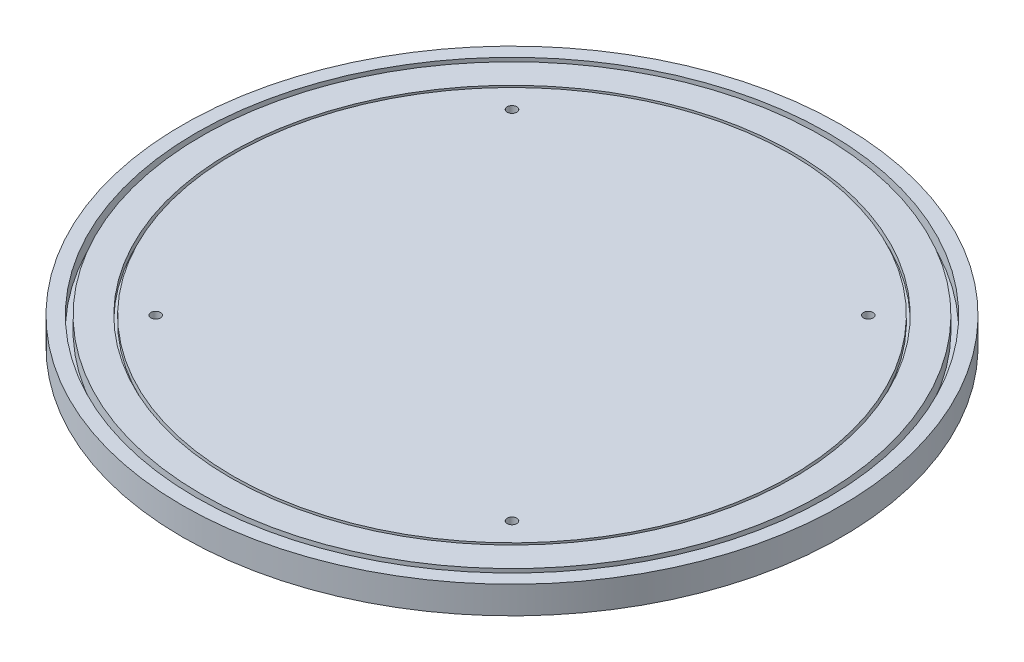
ISO-10303-21;
HEADER;
FILE_DESCRIPTION(('STEP AP214'),'2;1');
FILE_NAME('part.step','',(''),(''),'','','');
FILE_SCHEMA(('AUTOMOTIVE_DESIGN { 1 0 10303 214 1 1 1 1 }'));
ENDSEC;
DATA;
#1=APPLICATION_CONTEXT('core data for automotive mechanical design processes');
#2=APPLICATION_PROTOCOL_DEFINITION('international standard','automotive_design',2000,#1);
#3=PRODUCT_CONTEXT('',#1,'mechanical');
#4=PRODUCT('Part','Part','',(#3));
#5=PRODUCT_RELATED_PRODUCT_CATEGORY('part','',(#4));
#6=PRODUCT_DEFINITION_FORMATION('','',#4);
#7=PRODUCT_DEFINITION_CONTEXT('part definition',#1,'design');
#8=PRODUCT_DEFINITION('design','',#6,#7);
#9=PRODUCT_DEFINITION_SHAPE('','',#8);
#10=(LENGTH_UNIT() NAMED_UNIT(*) SI_UNIT(.MILLI.,.METRE.));
#11=(NAMED_UNIT(*) PLANE_ANGLE_UNIT() SI_UNIT($,.RADIAN.));
#12=(NAMED_UNIT(*) SI_UNIT($,.STERADIAN.) SOLID_ANGLE_UNIT());
#13=UNCERTAINTY_MEASURE_WITH_UNIT(LENGTH_MEASURE(1.E-05),#10,'distance_accuracy_value','');
#14=(GEOMETRIC_REPRESENTATION_CONTEXT(3) GLOBAL_UNCERTAINTY_ASSIGNED_CONTEXT((#13)) GLOBAL_UNIT_ASSIGNED_CONTEXT((#10,
#11,#12)) REPRESENTATION_CONTEXT('',''));
#15=CARTESIAN_POINT('',(0.,0.,0.));
#16=DIRECTION('',(0.,0.,1.));
#17=DIRECTION('',(1.,0.,0.));
#18=AXIS2_PLACEMENT_3D('',#15,#16,#17);
#19=CARTESIAN_POINT('',(0.,10.,-115.250303869911));
#20=DIRECTION('',(0.,-1.,0.));
#21=DIRECTION('',(0.,0.,-1.));
#22=AXIS2_PLACEMENT_3D('',#19,#20,#21);
#23=PLANE('',#22);
#24=CARTESIAN_POINT('',(0.,10.,-0.00437551765879174));
#25=DIRECTION('',(0.,1.,0.));
#26=DIRECTION('',(0.,0.,1.));
#27=AXIS2_PLACEMENT_3D('',#24,#25,#26);
#28=CIRCLE('',#27,115.245928352253);
#29=CARTESIAN_POINT('',(0.,10.,115.241552834594));
#30=VERTEX_POINT('',#29);
#31=EDGE_CURVE('E69',#30,#30,#28,.T.);
#32=ORIENTED_EDGE('',*,*,#31,.F.);
#33=EDGE_LOOP('',(#32));
#34=FACE_BOUND('',#33,.T.);
#35=CARTESIAN_POINT('',(0.,10.,-0.00437551765879174));
#36=DIRECTION('',(0.,1.,0.));
#37=DIRECTION('',(0.,0.,1.));
#38=AXIS2_PLACEMENT_3D('',#35,#36,#37);
#39=CIRCLE('',#38,120.249921644883);
#40=CARTESIAN_POINT('',(0.,10.,120.245546127224));
#41=VERTEX_POINT('',#40);
#42=EDGE_CURVE('E10',#41,#41,#39,.T.);
#43=ORIENTED_EDGE('',*,*,#42,.T.);
#44=EDGE_LOOP('',(#43));
#45=FACE_BOUND('',#44,.T.);
#46=ADVANCED_FACE('F35',(#34,#45),#23,.F.);
#47=CARTESIAN_POINT('',(0.,9.99999999999999,-0.00437551765879174));
#48=DIRECTION('',(0.,1.,0.));
#49=DIRECTION('',(0.,0.,1.));
#50=AXIS2_PLACEMENT_3D('',#47,#48,#49);
#51=CYLINDRICAL_SURFACE('',#50,120.249921644883);
#52=ORIENTED_EDGE('',*,*,#42,.F.);
#53=EDGE_LOOP('',(#52));
#54=FACE_BOUND('',#53,.T.);
#55=CARTESIAN_POINT('',(0.,0.,-0.00437551765879174));
#56=DIRECTION('',(0.,1.,0.));
#57=DIRECTION('',(0.,0.,1.));
#58=AXIS2_PLACEMENT_3D('',#55,#56,#57);
#59=CIRCLE('',#58,120.249921644883);
#60=CARTESIAN_POINT('',(0.,0.,120.245546127224));
#61=VERTEX_POINT('',#60);
#62=EDGE_CURVE('E41',#61,#61,#59,.T.);
#63=ORIENTED_EDGE('',*,*,#62,.T.);
#64=EDGE_LOOP('',(#63));
#65=FACE_BOUND('',#64,.T.);
#66=ADVANCED_FACE('F111',(#54,#65),#51,.T.);
#67=CARTESIAN_POINT('',(0.,0.,-120.254297162542));
#68=DIRECTION('',(0.,1.,0.));
#69=DIRECTION('',(0.,0.,1.));
#70=AXIS2_PLACEMENT_3D('',#67,#68,#69);
#71=PLANE('',#70);
#72=CARTESIAN_POINT('',(-65.,0.,-65.));
#73=DIRECTION('',(0.,-1.,0.));
#74=DIRECTION('',(0.,0.,-1.));
#75=AXIS2_PLACEMENT_3D('',#72,#73,#74);
#76=CIRCLE('',#75,1.75);
#77=CARTESIAN_POINT('',(-65.,0.,-66.75));
#78=VERTEX_POINT('',#77);
#79=EDGE_CURVE('E86',#78,#78,#76,.T.);
#80=ORIENTED_EDGE('',*,*,#79,.F.);
#81=EDGE_LOOP('',(#80));
#82=FACE_BOUND('',#81,.T.);
#83=CARTESIAN_POINT('',(65.,0.,65.));
#84=DIRECTION('',(0.,-1.,0.));
#85=DIRECTION('',(0.,0.,-1.));
#86=AXIS2_PLACEMENT_3D('',#83,#84,#85);
#87=CIRCLE('',#86,1.75);
#88=CARTESIAN_POINT('',(65.,0.,63.25));
#89=VERTEX_POINT('',#88);
#90=EDGE_CURVE('E79',#89,#89,#87,.T.);
#91=ORIENTED_EDGE('',*,*,#90,.F.);
#92=EDGE_LOOP('',(#91));
#93=FACE_BOUND('',#92,.T.);
#94=CARTESIAN_POINT('',(65.,0.,-65.));
#95=DIRECTION('',(0.,-1.,0.));
#96=DIRECTION('',(0.,0.,-1.));
#97=AXIS2_PLACEMENT_3D('',#94,#95,#96);
#98=CIRCLE('',#97,1.75);
#99=CARTESIAN_POINT('',(65.,0.,-66.75));
#100=VERTEX_POINT('',#99);
#101=EDGE_CURVE('E91',#100,#100,#98,.T.);
#102=ORIENTED_EDGE('',*,*,#101,.F.);
#103=EDGE_LOOP('',(#102));
#104=FACE_BOUND('',#103,.T.);
#105=CARTESIAN_POINT('',(-65.,0.,65.));
#106=DIRECTION('',(0.,-1.,0.));
#107=DIRECTION('',(0.,0.,-1.));
#108=AXIS2_PLACEMENT_3D('',#105,#106,#107);
#109=CIRCLE('',#108,1.75);
#110=CARTESIAN_POINT('',(-65.,0.,63.25));
#111=VERTEX_POINT('',#110);
#112=EDGE_CURVE('E73',#111,#111,#109,.T.);
#113=ORIENTED_EDGE('',*,*,#112,.F.);
#114=EDGE_LOOP('',(#113));
#115=FACE_BOUND('',#114,.T.);
#116=ORIENTED_EDGE('',*,*,#62,.F.);
#117=EDGE_LOOP('',(#116));
#118=FACE_BOUND('',#117,.T.);
#119=ADVANCED_FACE('F108',(#82,#93,#104,#115,#118),#71,.F.);
#120=CARTESIAN_POINT('',(0.,9.99999999999999,-101.754375517659));
#121=DIRECTION('',(0.,-1.,0.));
#122=DIRECTION('',(0.,0.,-1.));
#123=AXIS2_PLACEMENT_3D('',#120,#121,#122);
#124=PLANE('',#123);
#125=CARTESIAN_POINT('',(-65.,10.,-65.));
#126=DIRECTION('',(0.,-1.,0.));
#127=DIRECTION('',(0.,0.,-1.));
#128=AXIS2_PLACEMENT_3D('',#125,#126,#127);
#129=CIRCLE('',#128,1.75);
#130=CARTESIAN_POINT('',(-65.,10.,-66.75));
#131=VERTEX_POINT('',#130);
#132=EDGE_CURVE('E76',#131,#131,#129,.T.);
#133=ORIENTED_EDGE('',*,*,#132,.T.);
#134=EDGE_LOOP('',(#133));
#135=FACE_BOUND('',#134,.T.);
#136=CARTESIAN_POINT('',(65.,10.,65.));
#137=DIRECTION('',(0.,-1.,0.));
#138=DIRECTION('',(0.,0.,-1.));
#139=AXIS2_PLACEMENT_3D('',#136,#137,#138);
#140=CIRCLE('',#139,1.75);
#141=CARTESIAN_POINT('',(65.,10.,63.25));
#142=VERTEX_POINT('',#141);
#143=EDGE_CURVE('E82',#142,#142,#140,.T.);
#144=ORIENTED_EDGE('',*,*,#143,.T.);
#145=EDGE_LOOP('',(#144));
#146=FACE_BOUND('',#145,.T.);
#147=CARTESIAN_POINT('',(65.,10.,-65.));
#148=DIRECTION('',(0.,-1.,0.));
#149=DIRECTION('',(0.,0.,-1.));
#150=AXIS2_PLACEMENT_3D('',#147,#148,#149);
#151=CIRCLE('',#150,1.75);
#152=CARTESIAN_POINT('',(65.,10.,-66.75));
#153=VERTEX_POINT('',#152);
#154=EDGE_CURVE('E83',#153,#153,#151,.T.);
#155=ORIENTED_EDGE('',*,*,#154,.T.);
#156=EDGE_LOOP('',(#155));
#157=FACE_BOUND('',#156,.T.);
#158=CARTESIAN_POINT('',(-65.,10.,65.));
#159=DIRECTION('',(0.,-1.,0.));
#160=DIRECTION('',(0.,0.,-1.));
#161=AXIS2_PLACEMENT_3D('',#158,#159,#160);
#162=CIRCLE('',#161,1.75);
#163=CARTESIAN_POINT('',(-65.,10.,63.25));
#164=VERTEX_POINT('',#163);
#165=EDGE_CURVE('E72',#164,#164,#162,.T.);
#166=ORIENTED_EDGE('',*,*,#165,.T.);
#167=EDGE_LOOP('',(#166));
#168=FACE_BOUND('',#167,.T.);
#169=CARTESIAN_POINT('',(0.,10.,-0.00437551765879174));
#170=DIRECTION('',(0.,1.,0.));
#171=DIRECTION('',(0.,0.,1.));
#172=AXIS2_PLACEMENT_3D('',#169,#170,#171);
#173=CIRCLE('',#172,101.75);
#174=CARTESIAN_POINT('',(0.,10.,101.745624482341));
#175=VERTEX_POINT('',#174);
#176=EDGE_CURVE('E45',#175,#175,#173,.T.);
#177=ORIENTED_EDGE('',*,*,#176,.T.);
#178=EDGE_LOOP('',(#177));
#179=FACE_BOUND('',#178,.T.);
#180=ADVANCED_FACE('F97',(#135,#146,#157,#168,#179),#124,.F.);
#181=CARTESIAN_POINT('',(0.,9.99999999999999,-0.00437551765879174));
#182=DIRECTION('',(0.,1.,0.));
#183=DIRECTION('',(0.,0.,1.));
#184=AXIS2_PLACEMENT_3D('',#181,#182,#183);
#185=CYLINDRICAL_SURFACE('',#184,101.75);
#186=ORIENTED_EDGE('',*,*,#176,.F.);
#187=EDGE_LOOP('',(#186));
#188=FACE_BOUND('',#187,.T.);
#189=CARTESIAN_POINT('',(0.,7.87270313591691,-0.00437551765879174));
#190=DIRECTION('',(0.,1.,0.));
#191=DIRECTION('',(0.,0.,1.));
#192=AXIS2_PLACEMENT_3D('',#189,#190,#191);
#193=CIRCLE('',#192,101.75);
#194=CARTESIAN_POINT('',(0.,7.87270313591691,101.745624482341));
#195=VERTEX_POINT('',#194);
#196=EDGE_CURVE('E49',#195,#195,#193,.T.);
#197=ORIENTED_EDGE('',*,*,#196,.T.);
#198=EDGE_LOOP('',(#197));
#199=FACE_BOUND('',#198,.T.);
#200=ADVANCED_FACE('F142',(#188,#199),#185,.T.);
#201=CARTESIAN_POINT('',(0.,7.87270313591691,-101.754375517659));
#202=DIRECTION('',(0.,-1.,0.));
#203=DIRECTION('',(0.,0.,-1.));
#204=AXIS2_PLACEMENT_3D('',#201,#202,#203);
#205=PLANE('',#204);
#206=ORIENTED_EDGE('',*,*,#196,.F.);
#207=EDGE_LOOP('',(#206));
#208=FACE_BOUND('',#207,.T.);
#209=CARTESIAN_POINT('',(0.,7.87270313591691,-0.00437551765879174));
#210=DIRECTION('',(0.,1.,0.));
#211=DIRECTION('',(0.,0.,1.));
#212=AXIS2_PLACEMENT_3D('',#209,#210,#211);
#213=CIRCLE('',#212,102.75);
#214=CARTESIAN_POINT('',(0.,7.87270313591691,102.745624482341));
#215=VERTEX_POINT('',#214);
#216=EDGE_CURVE('E54',#215,#215,#213,.T.);
#217=ORIENTED_EDGE('',*,*,#216,.T.);
#218=EDGE_LOOP('',(#217));
#219=FACE_BOUND('',#218,.T.);
#220=ADVANCED_FACE('F146',(#208,#219),#205,.F.);
#221=CARTESIAN_POINT('',(0.,9.99999999999999,-0.00437551765879174));
#222=DIRECTION('',(0.,1.,0.));
#223=DIRECTION('',(0.,0.,1.));
#224=AXIS2_PLACEMENT_3D('',#221,#222,#223);
#225=CYLINDRICAL_SURFACE('',#224,102.75);
#226=ORIENTED_EDGE('',*,*,#216,.F.);
#227=EDGE_LOOP('',(#226));
#228=FACE_BOUND('',#227,.T.);
#229=CARTESIAN_POINT('',(0.,10.,-0.00437551765879174));
#230=DIRECTION('',(0.,1.,0.));
#231=DIRECTION('',(0.,0.,1.));
#232=AXIS2_PLACEMENT_3D('',#229,#230,#231);
#233=CIRCLE('',#232,102.75);
#234=CARTESIAN_POINT('',(0.,10.,102.745624482341));
#235=VERTEX_POINT('',#234);
#236=EDGE_CURVE('E57',#235,#235,#233,.T.);
#237=ORIENTED_EDGE('',*,*,#236,.T.);
#238=EDGE_LOOP('',(#237));
#239=FACE_BOUND('',#238,.T.);
#240=ADVANCED_FACE('F150',(#228,#239),#225,.F.);
#241=CARTESIAN_POINT('',(0.,10.,-102.754375517659));
#242=DIRECTION('',(0.,-1.,0.));
#243=DIRECTION('',(0.,0.,-1.));
#244=AXIS2_PLACEMENT_3D('',#241,#242,#243);
#245=PLANE('',#244);
#246=ORIENTED_EDGE('',*,*,#236,.F.);
#247=EDGE_LOOP('',(#246));
#248=FACE_BOUND('',#247,.T.);
#249=CARTESIAN_POINT('',(0.,10.,-0.00437551765879174));
#250=DIRECTION('',(0.,1.,0.));
#251=DIRECTION('',(0.,0.,1.));
#252=AXIS2_PLACEMENT_3D('',#249,#250,#251);
#253=CIRCLE('',#252,113.25);
#254=CARTESIAN_POINT('',(0.,10.,113.245624482341));
#255=VERTEX_POINT('',#254);
#256=EDGE_CURVE('E60',#255,#255,#253,.T.);
#257=ORIENTED_EDGE('',*,*,#256,.T.);
#258=EDGE_LOOP('',(#257));
#259=FACE_BOUND('',#258,.T.);
#260=ADVANCED_FACE('F154',(#248,#259),#245,.F.);
#261=CARTESIAN_POINT('',(0.,9.99999999999999,-0.00437551765879174));
#262=DIRECTION('',(0.,1.,0.));
#263=DIRECTION('',(0.,0.,1.));
#264=AXIS2_PLACEMENT_3D('',#261,#262,#263);
#265=CYLINDRICAL_SURFACE('',#264,113.25);
#266=ORIENTED_EDGE('',*,*,#256,.F.);
#267=EDGE_LOOP('',(#266));
#268=FACE_BOUND('',#267,.T.);
#269=CARTESIAN_POINT('',(0.,5.,-0.00437551765879174));
#270=DIRECTION('',(0.,1.,0.));
#271=DIRECTION('',(0.,0.,1.));
#272=AXIS2_PLACEMENT_3D('',#269,#270,#271);
#273=CIRCLE('',#272,113.25);
#274=CARTESIAN_POINT('',(0.,5.,113.245624482341));
#275=VERTEX_POINT('',#274);
#276=EDGE_CURVE('E63',#275,#275,#273,.T.);
#277=ORIENTED_EDGE('',*,*,#276,.T.);
#278=EDGE_LOOP('',(#277));
#279=FACE_BOUND('',#278,.T.);
#280=ADVANCED_FACE('F158',(#268,#279),#265,.T.);
#281=CARTESIAN_POINT('',(0.,5.,-113.254375517659));
#282=DIRECTION('',(0.,-1.,0.));
#283=DIRECTION('',(0.,0.,-1.));
#284=AXIS2_PLACEMENT_3D('',#281,#282,#283);
#285=PLANE('',#284);
#286=ORIENTED_EDGE('',*,*,#276,.F.);
#287=EDGE_LOOP('',(#286));
#288=FACE_BOUND('',#287,.T.);
#289=CARTESIAN_POINT('',(0.,5.,-0.00437551765879174));
#290=DIRECTION('',(0.,1.,0.));
#291=DIRECTION('',(0.,0.,1.));
#292=AXIS2_PLACEMENT_3D('',#289,#290,#291);
#293=CIRCLE('',#292,115.245928352253);
#294=CARTESIAN_POINT('',(0.,5.,115.241552834594));
#295=VERTEX_POINT('',#294);
#296=EDGE_CURVE('E66',#295,#295,#293,.T.);
#297=ORIENTED_EDGE('',*,*,#296,.T.);
#298=EDGE_LOOP('',(#297));
#299=FACE_BOUND('',#298,.T.);
#300=ADVANCED_FACE('F124',(#288,#299),#285,.F.);
#301=CARTESIAN_POINT('',(0.,9.99999999999999,-0.00437551765879174));
#302=DIRECTION('',(0.,1.,0.));
#303=DIRECTION('',(0.,0.,1.));
#304=AXIS2_PLACEMENT_3D('',#301,#302,#303);
#305=CYLINDRICAL_SURFACE('',#304,115.245928352253);
#306=ORIENTED_EDGE('',*,*,#296,.F.);
#307=EDGE_LOOP('',(#306));
#308=FACE_BOUND('',#307,.T.);
#309=ORIENTED_EDGE('',*,*,#31,.T.);
#310=EDGE_LOOP('',(#309));
#311=FACE_BOUND('',#310,.T.);
#312=ADVANCED_FACE('F118',(#308,#311),#305,.F.);
#313=CARTESIAN_POINT('',(-65.,10.,65.));
#314=DIRECTION('',(0.,-1.,0.));
#315=DIRECTION('',(0.,0.,-1.));
#316=AXIS2_PLACEMENT_3D('',#313,#314,#315);
#317=CYLINDRICAL_SURFACE('',#316,1.75);
#318=ORIENTED_EDGE('',*,*,#165,.F.);
#319=EDGE_LOOP('',(#318));
#320=FACE_BOUND('',#319,.T.);
#321=ORIENTED_EDGE('',*,*,#112,.T.);
#322=EDGE_LOOP('',(#321));
#323=FACE_BOUND('',#322,.T.);
#324=ADVANCED_FACE('F104',(#320,#323),#317,.F.);
#325=CARTESIAN_POINT('',(65.,10.,-65.));
#326=DIRECTION('',(0.,-1.,0.));
#327=DIRECTION('',(0.,0.,-1.));
#328=AXIS2_PLACEMENT_3D('',#325,#326,#327);
#329=CYLINDRICAL_SURFACE('',#328,1.75);
#330=ORIENTED_EDGE('',*,*,#154,.F.);
#331=EDGE_LOOP('',(#330));
#332=FACE_BOUND('',#331,.T.);
#333=ORIENTED_EDGE('',*,*,#101,.T.);
#334=EDGE_LOOP('',(#333));
#335=FACE_BOUND('',#334,.T.);
#336=ADVANCED_FACE('F100',(#332,#335),#329,.F.);
#337=CARTESIAN_POINT('',(65.,10.,65.));
#338=DIRECTION('',(0.,-1.,0.));
#339=DIRECTION('',(0.,0.,-1.));
#340=AXIS2_PLACEMENT_3D('',#337,#338,#339);
#341=CYLINDRICAL_SURFACE('',#340,1.75);
#342=ORIENTED_EDGE('',*,*,#143,.F.);
#343=EDGE_LOOP('',(#342));
#344=FACE_BOUND('',#343,.T.);
#345=ORIENTED_EDGE('',*,*,#90,.T.);
#346=EDGE_LOOP('',(#345));
#347=FACE_BOUND('',#346,.T.);
#348=ADVANCED_FACE('F103',(#344,#347),#341,.F.);
#349=CARTESIAN_POINT('',(-65.,10.,-65.));
#350=DIRECTION('',(0.,-1.,0.));
#351=DIRECTION('',(0.,0.,-1.));
#352=AXIS2_PLACEMENT_3D('',#349,#350,#351);
#353=CYLINDRICAL_SURFACE('',#352,1.75);
#354=ORIENTED_EDGE('',*,*,#132,.F.);
#355=EDGE_LOOP('',(#354));
#356=FACE_BOUND('',#355,.T.);
#357=ORIENTED_EDGE('',*,*,#79,.T.);
#358=EDGE_LOOP('',(#357));
#359=FACE_BOUND('',#358,.T.);
#360=ADVANCED_FACE('F212',(#356,#359),#353,.F.);
#361=CLOSED_SHELL('',(#46,#66,#119,#180,#200,#220,#240,#260,#280,#300,#312,#324,#336,#348,#360));
#362=MANIFOLD_SOLID_BREP('B2',#361);
#363=ADVANCED_BREP_SHAPE_REPRESENTATION('',(#18,#362),#14);
#364=SHAPE_DEFINITION_REPRESENTATION(#9,#363);
ENDSEC;
END-ISO-10303-21;
